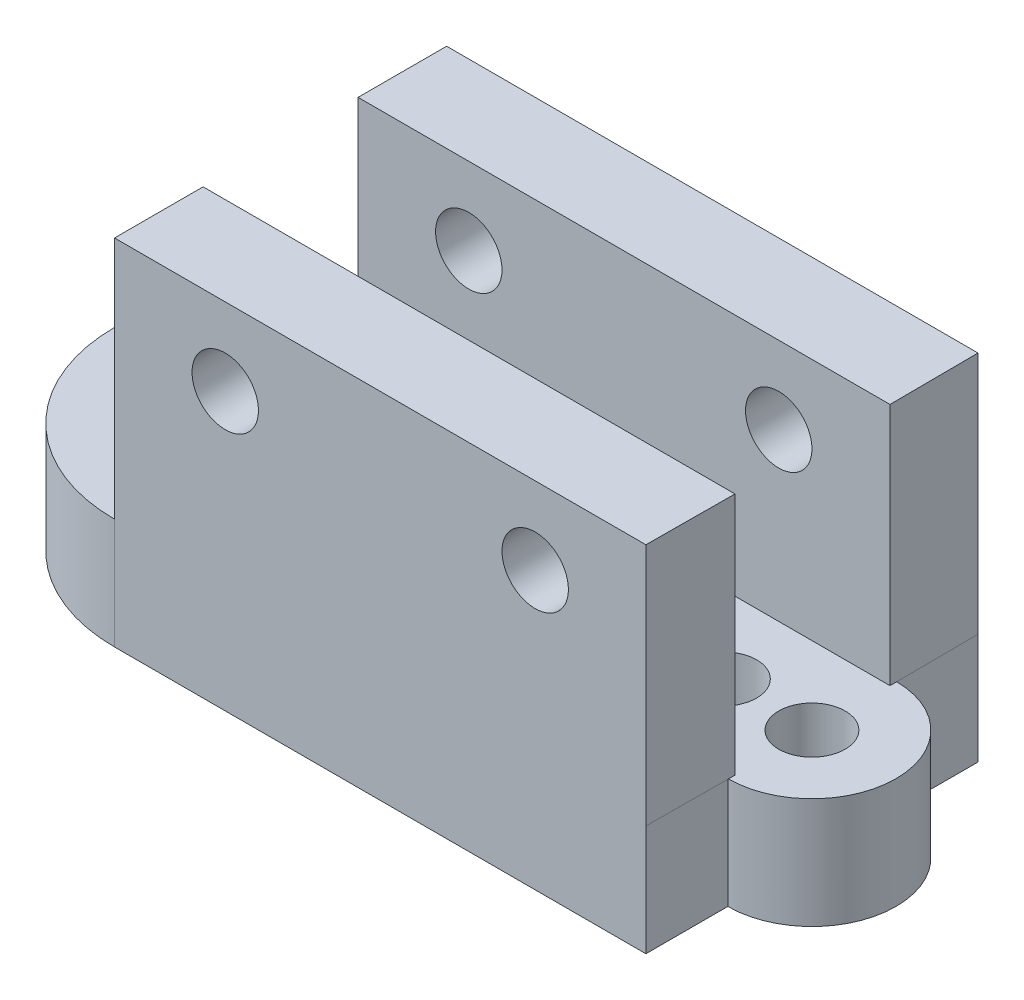
ISO-10303-21;
HEADER;
FILE_DESCRIPTION(('STEP AP214'),'2;1');
FILE_NAME('part.step','',(''),(''),'','','');
FILE_SCHEMA(('AUTOMOTIVE_DESIGN { 1 0 10303 214 1 1 1 1 }'));
ENDSEC;
DATA;
#1=APPLICATION_CONTEXT('core data for automotive mechanical design processes');
#2=APPLICATION_PROTOCOL_DEFINITION('international standard','automotive_design',2000,#1);
#3=PRODUCT_CONTEXT('',#1,'mechanical');
#4=PRODUCT('Part','Part','',(#3));
#5=PRODUCT_RELATED_PRODUCT_CATEGORY('part','',(#4));
#6=PRODUCT_DEFINITION_FORMATION('','',#4);
#7=PRODUCT_DEFINITION_CONTEXT('part definition',#1,'design');
#8=PRODUCT_DEFINITION('design','',#6,#7);
#9=PRODUCT_DEFINITION_SHAPE('','',#8);
#10=(LENGTH_UNIT() NAMED_UNIT(*) SI_UNIT(.MILLI.,.METRE.));
#11=(NAMED_UNIT(*) PLANE_ANGLE_UNIT() SI_UNIT($,.RADIAN.));
#12=(NAMED_UNIT(*) SI_UNIT($,.STERADIAN.) SOLID_ANGLE_UNIT());
#13=UNCERTAINTY_MEASURE_WITH_UNIT(LENGTH_MEASURE(1.E-05),#10,'distance_accuracy_value','');
#14=(GEOMETRIC_REPRESENTATION_CONTEXT(3) GLOBAL_UNCERTAINTY_ASSIGNED_CONTEXT((#13)) GLOBAL_UNIT_ASSIGNED_CONTEXT((#10,
#11,#12)) REPRESENTATION_CONTEXT('',''));
#15=CARTESIAN_POINT('',(0.,0.,0.));
#16=DIRECTION('',(0.,0.,1.));
#17=DIRECTION('',(1.,0.,0.));
#18=AXIS2_PLACEMENT_3D('',#15,#16,#17);
#19=CARTESIAN_POINT('',(0.,5.,7.5));
#20=DIRECTION('',(0.,0.,-1.));
#21=DIRECTION('',(-1.,0.,0.));
#22=AXIS2_PLACEMENT_3D('',#19,#20,#21);
#23=PLANE('',#22);
#24=CARTESIAN_POINT('',(5.00000000000008,12.5,7.5));
#25=DIRECTION('',(0.,0.,1.));
#26=DIRECTION('',(1.,0.,0.));
#27=AXIS2_PLACEMENT_3D('',#24,#25,#26);
#28=CIRCLE('',#27,1.5);
#29=CARTESIAN_POINT('',(6.50000000000008,12.5,7.5));
#30=VERTEX_POINT('',#29);
#31=EDGE_CURVE('E616',#30,#30,#28,.T.);
#32=ORIENTED_EDGE('',*,*,#31,.F.);
#33=EDGE_LOOP('',(#32));
#34=FACE_BOUND('',#33,.T.);
#35=DIRECTION('',(1.,0.,0.));
#36=VECTOR('',#35,1.);
#37=CARTESIAN_POINT('',(0.,0.,7.5));
#38=LINE('',#37,#36);
#39=CARTESIAN_POINT('',(0.,0.,7.5));
#40=VERTEX_POINT('',#39);
#41=CARTESIAN_POINT('',(24.,0.,7.5));
#42=VERTEX_POINT('',#41);
#43=EDGE_CURVE('E275',#40,#42,#38,.T.);
#44=ORIENTED_EDGE('',*,*,#43,.T.);
#45=DIRECTION('',(0.,-1.,0.));
#46=VECTOR('',#45,1.);
#47=CARTESIAN_POINT('',(24.,5.,7.5));
#48=LINE('',#47,#46);
#49=CARTESIAN_POINT('',(24.,5.,7.5));
#50=VERTEX_POINT('',#49);
#51=EDGE_CURVE('E290',#50,#42,#48,.T.);
#52=ORIENTED_EDGE('',*,*,#51,.F.);
#53=DIRECTION('',(0.,-1.,0.));
#54=VECTOR('',#53,1.);
#55=CARTESIAN_POINT('',(24.,16.,7.5));
#56=LINE('',#55,#54);
#57=CARTESIAN_POINT('',(24.,16.,7.5));
#58=VERTEX_POINT('',#57);
#59=EDGE_CURVE('E239',#58,#50,#56,.T.);
#60=ORIENTED_EDGE('',*,*,#59,.F.);
#61=DIRECTION('',(1.,0.,0.));
#62=VECTOR('',#61,1.);
#63=CARTESIAN_POINT('',(24.,16.,7.5));
#64=LINE('',#63,#62);
#65=CARTESIAN_POINT('',(0.,16.,7.5));
#66=VERTEX_POINT('',#65);
#67=EDGE_CURVE('E214',#66,#58,#64,.T.);
#68=ORIENTED_EDGE('',*,*,#67,.F.);
#69=DIRECTION('',(0.,-1.,0.));
#70=VECTOR('',#69,1.);
#71=CARTESIAN_POINT('',(0.,16.,7.5));
#72=LINE('',#71,#70);
#73=CARTESIAN_POINT('',(0.,5.,7.5));
#74=VERTEX_POINT('',#73);
#75=EDGE_CURVE('E223',#66,#74,#72,.T.);
#76=ORIENTED_EDGE('',*,*,#75,.T.);
#77=DIRECTION('',(0.,-1.,0.));
#78=VECTOR('',#77,1.);
#79=CARTESIAN_POINT('',(0.,5.,7.5));
#80=LINE('',#79,#78);
#81=EDGE_CURVE('E293',#74,#40,#80,.T.);
#82=ORIENTED_EDGE('',*,*,#81,.T.);
#83=EDGE_LOOP('',(#44,#52,#60,#68,#76,#82));
#84=FACE_BOUND('',#83,.T.);
#85=CARTESIAN_POINT('',(19.,12.5,7.5));
#86=DIRECTION('',(0.,0.,1.));
#87=DIRECTION('',(1.,0.,0.));
#88=AXIS2_PLACEMENT_3D('',#85,#86,#87);
#89=CIRCLE('',#88,1.5);
#90=CARTESIAN_POINT('',(20.5,12.5,7.5));
#91=VERTEX_POINT('',#90);
#92=EDGE_CURVE('E310',#91,#91,#89,.T.);
#93=ORIENTED_EDGE('',*,*,#92,.F.);
#94=EDGE_LOOP('',(#93));
#95=FACE_BOUND('',#94,.T.);
#96=ADVANCED_FACE('F36',(#34,#84,#95),#23,.F.);
#97=CARTESIAN_POINT('',(0.,5.,-7.5));
#98=DIRECTION('',(0.,0.,-1.));
#99=DIRECTION('',(-1.,0.,0.));
#100=AXIS2_PLACEMENT_3D('',#97,#98,#99);
#101=PLANE('',#100);
#102=CARTESIAN_POINT('',(5.00000000000008,12.5,-7.5));
#103=DIRECTION('',(0.,0.,1.));
#104=DIRECTION('',(1.,0.,0.));
#105=AXIS2_PLACEMENT_3D('',#102,#103,#104);
#106=CIRCLE('',#105,1.5);
#107=CARTESIAN_POINT('',(6.50000000000008,12.5,-7.5));
#108=VERTEX_POINT('',#107);
#109=EDGE_CURVE('E613',#108,#108,#106,.T.);
#110=ORIENTED_EDGE('',*,*,#109,.T.);
#111=EDGE_LOOP('',(#110));
#112=FACE_BOUND('',#111,.T.);
#113=DIRECTION('',(1.,0.,0.));
#114=VECTOR('',#113,1.);
#115=CARTESIAN_POINT('',(0.,0.,-7.5));
#116=LINE('',#115,#114);
#117=CARTESIAN_POINT('',(0.,0.,-7.5));
#118=VERTEX_POINT('',#117);
#119=CARTESIAN_POINT('',(24.,0.,-7.5));
#120=VERTEX_POINT('',#119);
#121=EDGE_CURVE('E270',#118,#120,#116,.T.);
#122=ORIENTED_EDGE('',*,*,#121,.F.);
#123=DIRECTION('',(0.,-1.,0.));
#124=VECTOR('',#123,1.);
#125=CARTESIAN_POINT('',(0.,5.,-7.5));
#126=LINE('',#125,#124);
#127=CARTESIAN_POINT('',(0.,5.,-7.5));
#128=VERTEX_POINT('',#127);
#129=EDGE_CURVE('E296',#128,#118,#126,.T.);
#130=ORIENTED_EDGE('',*,*,#129,.F.);
#131=DIRECTION('',(0.,-1.,0.));
#132=VECTOR('',#131,1.);
#133=CARTESIAN_POINT('',(0.,16.,-7.5));
#134=LINE('',#133,#132);
#135=CARTESIAN_POINT('',(0.,16.,-7.5));
#136=VERTEX_POINT('',#135);
#137=EDGE_CURVE('E206',#136,#128,#134,.T.);
#138=ORIENTED_EDGE('',*,*,#137,.F.);
#139=DIRECTION('',(-1.,0.,0.));
#140=VECTOR('',#139,1.);
#141=CARTESIAN_POINT('',(24.,16.,-7.5));
#142=LINE('',#141,#140);
#143=CARTESIAN_POINT('',(24.,16.,-7.5));
#144=VERTEX_POINT('',#143);
#145=EDGE_CURVE('E194',#144,#136,#142,.T.);
#146=ORIENTED_EDGE('',*,*,#145,.F.);
#147=DIRECTION('',(0.,-1.,0.));
#148=VECTOR('',#147,1.);
#149=CARTESIAN_POINT('',(24.,16.,-7.5));
#150=LINE('',#149,#148);
#151=CARTESIAN_POINT('',(24.,5.,-7.5));
#152=VERTEX_POINT('',#151);
#153=EDGE_CURVE('E208',#144,#152,#150,.T.);
#154=ORIENTED_EDGE('',*,*,#153,.T.);
#155=DIRECTION('',(0.,-1.,0.));
#156=VECTOR('',#155,1.);
#157=CARTESIAN_POINT('',(24.,5.,-7.5));
#158=LINE('',#157,#156);
#159=EDGE_CURVE('E298',#152,#120,#158,.T.);
#160=ORIENTED_EDGE('',*,*,#159,.T.);
#161=EDGE_LOOP('',(#122,#130,#138,#146,#154,#160));
#162=FACE_BOUND('',#161,.T.);
#163=CARTESIAN_POINT('',(19.,12.5,-7.5));
#164=DIRECTION('',(0.,0.,1.));
#165=DIRECTION('',(1.,0.,0.));
#166=AXIS2_PLACEMENT_3D('',#163,#164,#165);
#167=CIRCLE('',#166,1.5);
#168=CARTESIAN_POINT('',(20.5,12.5,-7.5));
#169=VERTEX_POINT('',#168);
#170=EDGE_CURVE('E303',#169,#169,#167,.T.);
#171=ORIENTED_EDGE('',*,*,#170,.T.);
#172=EDGE_LOOP('',(#171));
#173=FACE_BOUND('',#172,.T.);
#174=ADVANCED_FACE('F374',(#112,#162,#173),#101,.T.);
#175=CARTESIAN_POINT('',(0.,5.,0.));
#176=DIRECTION('',(0.,1.,0.));
#177=DIRECTION('',(0.,0.,1.));
#178=AXIS2_PLACEMENT_3D('',#175,#176,#177);
#179=PLANE('',#178);
#180=DIRECTION('',(0.,0.,1.));
#181=VECTOR('',#180,1.);
#182=CARTESIAN_POINT('',(12.,5.,0.));
#183=LINE('',#182,#181);
#184=CARTESIAN_POINT('',(12.,5.,-3.5));
#185=VERTEX_POINT('',#184);
#186=CARTESIAN_POINT('',(12.,5.,3.5));
#187=VERTEX_POINT('',#186);
#188=EDGE_CURVE('E307',#185,#187,#183,.T.);
#189=ORIENTED_EDGE('',*,*,#188,.T.);
#190=DIRECTION('',(-1.,0.,0.));
#191=VECTOR('',#190,1.);
#192=CARTESIAN_POINT('',(0.,5.,3.5));
#193=LINE('',#192,#191);
#194=CARTESIAN_POINT('',(24.0247124114035,5.,3.5));
#195=VERTEX_POINT('',#194);
#196=EDGE_CURVE('E226',#195,#187,#193,.T.);
#197=ORIENTED_EDGE('',*,*,#196,.F.);
#198=DIRECTION('',(0.0061779849483783,0.,-0.999980916068891));
#199=VECTOR('',#198,1.);
#200=CARTESIAN_POINT('',(24.0247124114035,5.,3.5));
#201=LINE('',#200,#199);
#202=CARTESIAN_POINT('',(24.0228594053392,5.,3.79993124248157));
#203=VERTEX_POINT('',#202);
#204=EDGE_CURVE('E11',#203,#195,#201,.T.);
#205=ORIENTED_EDGE('',*,*,#204,.F.);
#206=CARTESIAN_POINT('',(24.,5.,0.));
#207=DIRECTION('',(0.,1.,0.));
#208=DIRECTION('',(0.,0.,1.));
#209=AXIS2_PLACEMENT_3D('',#206,#207,#208);
#210=CIRCLE('',#209,3.8);
#211=CARTESIAN_POINT('',(24.0228594053392,5.,-3.79993124248157));
#212=VERTEX_POINT('',#211);
#213=EDGE_CURVE('E247',#212,#203,#210,.F.);
#214=ORIENTED_EDGE('',*,*,#213,.F.);
#215=DIRECTION('',(-0.0061779849483783,0.,-0.999980916068891));
#216=VECTOR('',#215,1.);
#217=CARTESIAN_POINT('',(24.0247124114035,5.,-3.5));
#218=LINE('',#217,#216);
#219=CARTESIAN_POINT('',(24.0247124114035,5.,-3.5));
#220=VERTEX_POINT('',#219);
#221=EDGE_CURVE('E201',#220,#212,#218,.T.);
#222=ORIENTED_EDGE('',*,*,#221,.F.);
#223=DIRECTION('',(1.,0.,0.));
#224=VECTOR('',#223,1.);
#225=CARTESIAN_POINT('',(0.,5.,-3.5));
#226=LINE('',#225,#224);
#227=EDGE_CURVE('E182',#185,#220,#226,.T.);
#228=ORIENTED_EDGE('',*,*,#227,.F.);
#229=EDGE_LOOP('',(#189,#197,#205,#214,#222,#228));
#230=FACE_BOUND('',#229,.T.);
#231=CARTESIAN_POINT('',(20.,5.,0.));
#232=DIRECTION('',(0.,1.,0.));
#233=DIRECTION('',(0.,0.,1.));
#234=AXIS2_PLACEMENT_3D('',#231,#232,#233);
#235=CIRCLE('',#234,1.5);
#236=CARTESIAN_POINT('',(20.,5.,1.5));
#237=VERTEX_POINT('',#236);
#238=EDGE_CURVE('E261',#237,#237,#235,.T.);
#239=ORIENTED_EDGE('',*,*,#238,.F.);
#240=EDGE_LOOP('',(#239));
#241=FACE_BOUND('',#240,.T.);
#242=CARTESIAN_POINT('',(24.,5.,0.));
#243=DIRECTION('',(0.,1.,0.));
#244=DIRECTION('',(0.,0.,1.));
#245=AXIS2_PLACEMENT_3D('',#242,#243,#244);
#246=CIRCLE('',#245,1.5);
#247=CARTESIAN_POINT('',(24.,5.,1.5));
#248=VERTEX_POINT('',#247);
#249=EDGE_CURVE('E258',#248,#248,#246,.T.);
#250=ORIENTED_EDGE('',*,*,#249,.F.);
#251=EDGE_LOOP('',(#250));
#252=FACE_BOUND('',#251,.T.);
#253=ADVANCED_FACE('F329',(#230,#241,#252),#179,.T.);
#254=DIRECTION('',(0.,0.,-1.));
#255=VECTOR('',#254,1.);
#256=CARTESIAN_POINT('',(8.,5.,0.));
#257=LINE('',#256,#255);
#258=CARTESIAN_POINT('',(8.,5.,3.5));
#259=VERTEX_POINT('',#258);
#260=CARTESIAN_POINT('',(8.,5.,-3.5));
#261=VERTEX_POINT('',#260);
#262=EDGE_CURVE('E319',#259,#261,#257,.T.);
#263=ORIENTED_EDGE('',*,*,#262,.T.);
#264=CARTESIAN_POINT('',(0.,5.,-3.5));
#265=VERTEX_POINT('',#264);
#266=EDGE_CURVE('E179',#265,#261,#226,.T.);
#267=ORIENTED_EDGE('',*,*,#266,.F.);
#268=DIRECTION('',(0.,0.,1.));
#269=VECTOR('',#268,1.);
#270=CARTESIAN_POINT('',(0.,5.,-7.5));
#271=LINE('',#270,#269);
#272=EDGE_CURVE('E192',#128,#265,#271,.T.);
#273=ORIENTED_EDGE('',*,*,#272,.F.);
#274=CARTESIAN_POINT('',(0.,5.,0.));
#275=DIRECTION('',(0.,1.,0.));
#276=DIRECTION('',(0.,0.,1.));
#277=AXIS2_PLACEMENT_3D('',#274,#275,#276);
#278=CIRCLE('',#277,7.5);
#279=EDGE_CURVE('E250',#128,#74,#278,.T.);
#280=ORIENTED_EDGE('',*,*,#279,.T.);
#281=DIRECTION('',(0.,0.,1.));
#282=VECTOR('',#281,1.);
#283=CARTESIAN_POINT('',(0.,5.,7.5));
#284=LINE('',#283,#282);
#285=CARTESIAN_POINT('',(0.,5.,3.5));
#286=VERTEX_POINT('',#285);
#287=EDGE_CURVE('E218',#286,#74,#284,.T.);
#288=ORIENTED_EDGE('',*,*,#287,.F.);
#289=EDGE_CURVE('E62',#259,#286,#193,.T.);
#290=ORIENTED_EDGE('',*,*,#289,.F.);
#291=EDGE_LOOP('',(#263,#267,#273,#280,#288,#290));
#292=FACE_BOUND('',#291,.T.);
#293=CARTESIAN_POINT('',(0.,5.,0.));
#294=DIRECTION('',(0.,1.,0.));
#295=DIRECTION('',(0.,0.,1.));
#296=AXIS2_PLACEMENT_3D('',#293,#294,#295);
#297=CIRCLE('',#296,1.5);
#298=CARTESIAN_POINT('',(0.,5.,1.5));
#299=VERTEX_POINT('',#298);
#300=EDGE_CURVE('E255',#299,#299,#297,.T.);
#301=ORIENTED_EDGE('',*,*,#300,.F.);
#302=EDGE_LOOP('',(#301));
#303=FACE_BOUND('',#302,.T.);
#304=ADVANCED_FACE('F368',(#292,#303),#179,.T.);
#305=CARTESIAN_POINT('',(24.,5.,0.));
#306=DIRECTION('',(0.,-1.,0.));
#307=DIRECTION('',(0.,0.,-1.));
#308=AXIS2_PLACEMENT_3D('',#305,#306,#307);
#309=CYLINDRICAL_SURFACE('',#308,3.8);
#310=CARTESIAN_POINT('',(24.,0.,0.));
#311=DIRECTION('',(0.,1.,0.));
#312=DIRECTION('',(0.,0.,1.));
#313=AXIS2_PLACEMENT_3D('',#310,#311,#312);
#314=CIRCLE('',#313,3.8);
#315=CARTESIAN_POINT('',(24.,0.,-3.8));
#316=VERTEX_POINT('',#315);
#317=CARTESIAN_POINT('',(24.,0.,3.8));
#318=VERTEX_POINT('',#317);
#319=EDGE_CURVE('E242',#316,#318,#314,.F.);
#320=ORIENTED_EDGE('',*,*,#319,.F.);
#321=DIRECTION('',(0.,-1.,0.));
#322=VECTOR('',#321,1.);
#323=CARTESIAN_POINT('',(24.,5.,-3.8));
#324=LINE('',#323,#322);
#325=CARTESIAN_POINT('',(24.,5.,-3.8));
#326=VERTEX_POINT('',#325);
#327=EDGE_CURVE('E45',#326,#316,#324,.T.);
#328=ORIENTED_EDGE('',*,*,#327,.F.);
#329=EDGE_CURVE('E243',#326,#212,#210,.F.);
#330=ORIENTED_EDGE('',*,*,#329,.T.);
#331=ORIENTED_EDGE('',*,*,#213,.T.);
#332=CARTESIAN_POINT('',(24.,5.,3.8));
#333=VERTEX_POINT('',#332);
#334=EDGE_CURVE('E248',#203,#333,#210,.F.);
#335=ORIENTED_EDGE('',*,*,#334,.T.);
#336=DIRECTION('',(0.,-1.,0.));
#337=VECTOR('',#336,1.);
#338=CARTESIAN_POINT('',(24.,5.,3.8));
#339=LINE('',#338,#337);
#340=EDGE_CURVE('E264',#333,#318,#339,.T.);
#341=ORIENTED_EDGE('',*,*,#340,.T.);
#342=EDGE_LOOP('',(#320,#328,#330,#331,#335,#341));
#343=FACE_BOUND('',#342,.T.);
#344=ADVANCED_FACE('F38',(#343),#309,.T.);
#345=CARTESIAN_POINT('',(24.,5.,0.));
#346=DIRECTION('',(-1.,0.,0.));
#347=DIRECTION('',(0.,0.,1.));
#348=AXIS2_PLACEMENT_3D('',#345,#346,#347);
#349=PLANE('',#348);
#350=DIRECTION('',(0.,0.,-1.));
#351=VECTOR('',#350,1.);
#352=CARTESIAN_POINT('',(24.,0.,0.));
#353=LINE('',#352,#351);
#354=EDGE_CURVE('E267',#316,#120,#353,.T.);
#355=ORIENTED_EDGE('',*,*,#354,.T.);
#356=ORIENTED_EDGE('',*,*,#159,.F.);
#357=DIRECTION('',(0.,0.,-1.));
#358=VECTOR('',#357,1.);
#359=CARTESIAN_POINT('',(24.,5.,0.));
#360=LINE('',#359,#358);
#361=EDGE_CURVE('E246',#326,#152,#360,.T.);
#362=ORIENTED_EDGE('',*,*,#361,.F.);
#363=ORIENTED_EDGE('',*,*,#327,.T.);
#364=EDGE_LOOP('',(#355,#356,#362,#363));
#365=FACE_BOUND('',#364,.T.);
#366=ADVANCED_FACE('F414',(#365),#349,.F.);
#367=CARTESIAN_POINT('',(0.,5.,0.));
#368=DIRECTION('',(0.,-1.,0.));
#369=DIRECTION('',(0.,0.,-1.));
#370=AXIS2_PLACEMENT_3D('',#367,#368,#369);
#371=CYLINDRICAL_SURFACE('',#370,7.5);
#372=CARTESIAN_POINT('',(0.,0.,0.));
#373=DIRECTION('',(0.,1.,0.));
#374=DIRECTION('',(0.,0.,1.));
#375=AXIS2_PLACEMENT_3D('',#372,#373,#374);
#376=CIRCLE('',#375,7.5);
#377=EDGE_CURVE('E273',#118,#40,#376,.T.);
#378=ORIENTED_EDGE('',*,*,#377,.T.);
#379=ORIENTED_EDGE('',*,*,#81,.F.);
#380=ORIENTED_EDGE('',*,*,#279,.F.);
#381=ORIENTED_EDGE('',*,*,#129,.T.);
#382=EDGE_LOOP('',(#378,#379,#380,#381));
#383=FACE_BOUND('',#382,.T.);
#384=ADVANCED_FACE('F377',(#383),#371,.T.);
#385=CARTESIAN_POINT('',(24.,5.,0.));
#386=DIRECTION('',(0.,-1.,0.));
#387=DIRECTION('',(0.,0.,-1.));
#388=AXIS2_PLACEMENT_3D('',#385,#386,#387);
#389=CYLINDRICAL_SURFACE('',#388,1.5);
#390=ORIENTED_EDGE('',*,*,#249,.T.);
#391=EDGE_LOOP('',(#390));
#392=FACE_BOUND('',#391,.T.);
#393=CARTESIAN_POINT('',(24.,0.,0.));
#394=DIRECTION('',(0.,1.,0.));
#395=DIRECTION('',(0.,0.,1.));
#396=AXIS2_PLACEMENT_3D('',#393,#394,#395);
#397=CIRCLE('',#396,1.5);
#398=CARTESIAN_POINT('',(24.,0.,1.5));
#399=VERTEX_POINT('',#398);
#400=EDGE_CURVE('E283',#399,#399,#397,.T.);
#401=ORIENTED_EDGE('',*,*,#400,.F.);
#402=EDGE_LOOP('',(#401));
#403=FACE_BOUND('',#402,.T.);
#404=ADVANCED_FACE('F413',(#392,#403),#389,.F.);
#405=CARTESIAN_POINT('',(0.,5.,0.));
#406=DIRECTION('',(0.,-1.,0.));
#407=DIRECTION('',(0.,0.,-1.));
#408=AXIS2_PLACEMENT_3D('',#405,#406,#407);
#409=CYLINDRICAL_SURFACE('',#408,1.5);
#410=ORIENTED_EDGE('',*,*,#300,.T.);
#411=EDGE_LOOP('',(#410));
#412=FACE_BOUND('',#411,.T.);
#413=CARTESIAN_POINT('',(0.,0.,0.));
#414=DIRECTION('',(0.,1.,0.));
#415=DIRECTION('',(0.,0.,1.));
#416=AXIS2_PLACEMENT_3D('',#413,#414,#415);
#417=CIRCLE('',#416,1.5);
#418=CARTESIAN_POINT('',(0.,0.,1.5));
#419=VERTEX_POINT('',#418);
#420=EDGE_CURVE('E280',#419,#419,#417,.T.);
#421=ORIENTED_EDGE('',*,*,#420,.F.);
#422=EDGE_LOOP('',(#421));
#423=FACE_BOUND('',#422,.T.);
#424=ADVANCED_FACE('F429',(#412,#423),#409,.F.);
#425=CARTESIAN_POINT('',(24.,5.,0.));
#426=DIRECTION('',(-1.,0.,0.));
#427=DIRECTION('',(0.,0.,1.));
#428=AXIS2_PLACEMENT_3D('',#425,#426,#427);
#429=PLANE('',#428);
#430=DIRECTION('',(0.,0.,-1.));
#431=VECTOR('',#430,1.);
#432=CARTESIAN_POINT('',(24.,0.,0.));
#433=LINE('',#432,#431);
#434=EDGE_CURVE('E277',#42,#318,#433,.T.);
#435=ORIENTED_EDGE('',*,*,#434,.T.);
#436=ORIENTED_EDGE('',*,*,#340,.F.);
#437=DIRECTION('',(0.,0.,-1.));
#438=VECTOR('',#437,1.);
#439=CARTESIAN_POINT('',(24.,5.,0.));
#440=LINE('',#439,#438);
#441=EDGE_CURVE('E252',#50,#333,#440,.T.);
#442=ORIENTED_EDGE('',*,*,#441,.F.);
#443=ORIENTED_EDGE('',*,*,#51,.T.);
#444=EDGE_LOOP('',(#435,#436,#442,#443));
#445=FACE_BOUND('',#444,.T.);
#446=ADVANCED_FACE('F410',(#445),#429,.F.);
#447=CARTESIAN_POINT('',(20.,5.,0.));
#448=DIRECTION('',(0.,-1.,0.));
#449=DIRECTION('',(0.,0.,-1.));
#450=AXIS2_PLACEMENT_3D('',#447,#448,#449);
#451=CYLINDRICAL_SURFACE('',#450,1.5);
#452=ORIENTED_EDGE('',*,*,#238,.T.);
#453=EDGE_LOOP('',(#452));
#454=FACE_BOUND('',#453,.T.);
#455=CARTESIAN_POINT('',(20.,0.,0.));
#456=DIRECTION('',(0.,1.,0.));
#457=DIRECTION('',(0.,0.,1.));
#458=AXIS2_PLACEMENT_3D('',#455,#456,#457);
#459=CIRCLE('',#458,1.5);
#460=CARTESIAN_POINT('',(20.,0.,1.5));
#461=VERTEX_POINT('',#460);
#462=EDGE_CURVE('E286',#461,#461,#459,.T.);
#463=ORIENTED_EDGE('',*,*,#462,.F.);
#464=EDGE_LOOP('',(#463));
#465=FACE_BOUND('',#464,.T.);
#466=ADVANCED_FACE('F428',(#454,#465),#451,.F.);
#467=CARTESIAN_POINT('',(0.,0.,0.));
#468=DIRECTION('',(0.,1.,0.));
#469=DIRECTION('',(0.,0.,1.));
#470=AXIS2_PLACEMENT_3D('',#467,#468,#469);
#471=PLANE('',#470);
#472=ORIENTED_EDGE('',*,*,#319,.T.);
#473=ORIENTED_EDGE('',*,*,#434,.F.);
#474=ORIENTED_EDGE('',*,*,#43,.F.);
#475=ORIENTED_EDGE('',*,*,#377,.F.);
#476=ORIENTED_EDGE('',*,*,#121,.T.);
#477=ORIENTED_EDGE('',*,*,#354,.F.);
#478=EDGE_LOOP('',(#472,#473,#474,#475,#476,#477));
#479=FACE_BOUND('',#478,.T.);
#480=ORIENTED_EDGE('',*,*,#420,.T.);
#481=EDGE_LOOP('',(#480));
#482=FACE_BOUND('',#481,.T.);
#483=ORIENTED_EDGE('',*,*,#400,.T.);
#484=EDGE_LOOP('',(#483));
#485=FACE_BOUND('',#484,.T.);
#486=ORIENTED_EDGE('',*,*,#462,.T.);
#487=EDGE_LOOP('',(#486));
#488=FACE_BOUND('',#487,.T.);
#489=ADVANCED_FACE('F423',(#479,#482,#485,#488),#471,.F.);
#490=CARTESIAN_POINT('',(0.,5.,0.));
#491=DIRECTION('',(0.,-1.,0.));
#492=DIRECTION('',(0.,0.,-1.));
#493=AXIS2_PLACEMENT_3D('',#490,#491,#492);
#494=PLANE('',#493);
#495=ORIENTED_EDGE('',*,*,#334,.F.);
#496=EDGE_CURVE('E47',#50,#203,#201,.T.);
#497=ORIENTED_EDGE('',*,*,#496,.F.);
#498=ORIENTED_EDGE('',*,*,#441,.T.);
#499=EDGE_LOOP('',(#495,#497,#498));
#500=FACE_BOUND('',#499,.T.);
#501=ADVANCED_FACE('F342',(#500),#494,.T.);
#502=CARTESIAN_POINT('',(24.0247124114035,16.,3.5));
#503=DIRECTION('',(-0.999980916068891,0.,-0.0061779849483783));
#504=DIRECTION('',(-0.0061779849483783,0.,0.999980916068891));
#505=AXIS2_PLACEMENT_3D('',#502,#503,#504);
#506=PLANE('',#505);
#507=ORIENTED_EDGE('',*,*,#496,.T.);
#508=ORIENTED_EDGE('',*,*,#204,.T.);
#509=DIRECTION('',(0.,-1.,0.));
#510=VECTOR('',#509,1.);
#511=CARTESIAN_POINT('',(24.0247124114035,16.,3.5));
#512=LINE('',#511,#510);
#513=CARTESIAN_POINT('',(24.0247124114035,16.,3.5));
#514=VERTEX_POINT('',#513);
#515=EDGE_CURVE('E236',#514,#195,#512,.T.);
#516=ORIENTED_EDGE('',*,*,#515,.F.);
#517=DIRECTION('',(0.0061779849483783,0.,-0.999980916068891));
#518=VECTOR('',#517,1.);
#519=CARTESIAN_POINT('',(24.0247124114035,16.,3.5));
#520=LINE('',#519,#518);
#521=EDGE_CURVE('E217',#58,#514,#520,.T.);
#522=ORIENTED_EDGE('',*,*,#521,.F.);
#523=ORIENTED_EDGE('',*,*,#59,.T.);
#524=EDGE_LOOP('',(#507,#508,#516,#522,#523));
#525=FACE_BOUND('',#524,.T.);
#526=ADVANCED_FACE('F337',(#525),#506,.F.);
#527=CARTESIAN_POINT('',(0.,16.,3.5));
#528=DIRECTION('',(0.,0.,1.));
#529=DIRECTION('',(1.,0.,0.));
#530=AXIS2_PLACEMENT_3D('',#527,#528,#529);
#531=PLANE('',#530);
#532=CARTESIAN_POINT('',(5.00000000000008,12.5,3.5));
#533=DIRECTION('',(0.,0.,1.));
#534=DIRECTION('',(1.,0.,0.));
#535=AXIS2_PLACEMENT_3D('',#532,#533,#534);
#536=CIRCLE('',#535,1.5);
#537=CARTESIAN_POINT('',(6.50000000000008,12.5,3.5));
#538=VERTEX_POINT('',#537);
#539=EDGE_CURVE('E315',#538,#538,#536,.T.);
#540=ORIENTED_EDGE('',*,*,#539,.T.);
#541=EDGE_LOOP('',(#540));
#542=FACE_BOUND('',#541,.T.);
#543=CARTESIAN_POINT('',(19.,12.5,3.5));
#544=DIRECTION('',(0.,0.,1.));
#545=DIRECTION('',(1.,0.,0.));
#546=AXIS2_PLACEMENT_3D('',#543,#544,#545);
#547=CIRCLE('',#546,1.5);
#548=CARTESIAN_POINT('',(20.5,12.5,3.5));
#549=VERTEX_POINT('',#548);
#550=EDGE_CURVE('E302',#549,#549,#547,.T.);
#551=ORIENTED_EDGE('',*,*,#550,.T.);
#552=EDGE_LOOP('',(#551));
#553=FACE_BOUND('',#552,.T.);
#554=ORIENTED_EDGE('',*,*,#196,.T.);
#555=DIRECTION('',(0.,-1.,0.));
#556=VECTOR('',#555,1.);
#557=CARTESIAN_POINT('',(12.,9.,3.5));
#558=LINE('',#557,#556);
#559=CARTESIAN_POINT('',(12.,9.,3.5));
#560=VERTEX_POINT('',#559);
#561=EDGE_CURVE('E184',#560,#187,#558,.T.);
#562=ORIENTED_EDGE('',*,*,#561,.F.);
#563=DIRECTION('',(1.,0.,0.));
#564=VECTOR('',#563,1.);
#565=CARTESIAN_POINT('',(0.,9.,3.5));
#566=LINE('',#565,#564);
#567=CARTESIAN_POINT('',(8.,9.,3.5));
#568=VERTEX_POINT('',#567);
#569=EDGE_CURVE('E173',#568,#560,#566,.T.);
#570=ORIENTED_EDGE('',*,*,#569,.F.);
#571=DIRECTION('',(0.,-1.,0.));
#572=VECTOR('',#571,1.);
#573=CARTESIAN_POINT('',(8.,9.,3.5));
#574=LINE('',#573,#572);
#575=EDGE_CURVE('E172',#568,#259,#574,.T.);
#576=ORIENTED_EDGE('',*,*,#575,.T.);
#577=ORIENTED_EDGE('',*,*,#289,.T.);
#578=DIRECTION('',(0.,-1.,0.));
#579=VECTOR('',#578,1.);
#580=CARTESIAN_POINT('',(0.,16.,3.5));
#581=LINE('',#580,#579);
#582=CARTESIAN_POINT('',(0.,16.,3.5));
#583=VERTEX_POINT('',#582);
#584=EDGE_CURVE('E233',#583,#286,#581,.T.);
#585=ORIENTED_EDGE('',*,*,#584,.F.);
#586=DIRECTION('',(-1.,0.,0.));
#587=VECTOR('',#586,1.);
#588=CARTESIAN_POINT('',(0.,16.,3.5));
#589=LINE('',#588,#587);
#590=EDGE_CURVE('E220',#514,#583,#589,.T.);
#591=ORIENTED_EDGE('',*,*,#590,.F.);
#592=ORIENTED_EDGE('',*,*,#515,.T.);
#593=EDGE_LOOP('',(#554,#562,#570,#576,#577,#585,#591,#592));
#594=FACE_BOUND('',#593,.T.);
#595=ADVANCED_FACE('F333',(#542,#553,#594),#531,.F.);
#596=CARTESIAN_POINT('',(0.,16.,7.5));
#597=DIRECTION('',(1.,0.,0.));
#598=DIRECTION('',(0.,0.,-1.));
#599=AXIS2_PLACEMENT_3D('',#596,#597,#598);
#600=PLANE('',#599);
#601=ORIENTED_EDGE('',*,*,#287,.T.);
#602=ORIENTED_EDGE('',*,*,#75,.F.);
#603=DIRECTION('',(0.,0.,1.));
#604=VECTOR('',#603,1.);
#605=CARTESIAN_POINT('',(0.,16.,7.5));
#606=LINE('',#605,#604);
#607=EDGE_CURVE('E222',#583,#66,#606,.T.);
#608=ORIENTED_EDGE('',*,*,#607,.F.);
#609=ORIENTED_EDGE('',*,*,#584,.T.);
#610=EDGE_LOOP('',(#601,#602,#608,#609));
#611=FACE_BOUND('',#610,.T.);
#612=ADVANCED_FACE('F382',(#611),#600,.F.);
#613=CARTESIAN_POINT('',(0.,16.,0.));
#614=DIRECTION('',(0.,-1.,0.));
#615=DIRECTION('',(0.,0.,-1.));
#616=AXIS2_PLACEMENT_3D('',#613,#614,#615);
#617=PLANE('',#616);
#618=ORIENTED_EDGE('',*,*,#67,.T.);
#619=ORIENTED_EDGE('',*,*,#521,.T.);
#620=ORIENTED_EDGE('',*,*,#590,.T.);
#621=ORIENTED_EDGE('',*,*,#607,.T.);
#622=EDGE_LOOP('',(#618,#619,#620,#621));
#623=FACE_BOUND('',#622,.T.);
#624=ADVANCED_FACE('F388',(#623),#617,.F.);
#625=CARTESIAN_POINT('',(0.,5.,0.));
#626=DIRECTION('',(0.,-1.,0.));
#627=DIRECTION('',(0.,0.,-1.));
#628=AXIS2_PLACEMENT_3D('',#625,#626,#627);
#629=PLANE('',#628);
#630=EDGE_CURVE('E200',#212,#152,#218,.T.);
#631=ORIENTED_EDGE('',*,*,#630,.F.);
#632=ORIENTED_EDGE('',*,*,#329,.F.);
#633=ORIENTED_EDGE('',*,*,#361,.T.);
#634=EDGE_LOOP('',(#631,#632,#633));
#635=FACE_BOUND('',#634,.T.);
#636=ADVANCED_FACE('F350',(#635),#629,.T.);
#637=CARTESIAN_POINT('',(0.,16.,-3.5));
#638=DIRECTION('',(0.,0.,-1.));
#639=DIRECTION('',(-1.,0.,0.));
#640=AXIS2_PLACEMENT_3D('',#637,#638,#639);
#641=PLANE('',#640);
#642=CARTESIAN_POINT('',(5.00000000000008,12.5,-3.5));
#643=DIRECTION('',(0.,0.,-1.));
#644=DIRECTION('',(-1.,0.,0.));
#645=AXIS2_PLACEMENT_3D('',#642,#643,#644);
#646=CIRCLE('',#645,1.5);
#647=CARTESIAN_POINT('',(3.50000000000008,12.5,-3.5));
#648=VERTEX_POINT('',#647);
#649=EDGE_CURVE('E40',#648,#648,#646,.T.);
#650=ORIENTED_EDGE('',*,*,#649,.T.);
#651=EDGE_LOOP('',(#650));
#652=FACE_BOUND('',#651,.T.);
#653=CARTESIAN_POINT('',(19.,12.5,-3.5));
#654=DIRECTION('',(0.,0.,-1.));
#655=DIRECTION('',(-1.,0.,0.));
#656=AXIS2_PLACEMENT_3D('',#653,#654,#655);
#657=CIRCLE('',#656,1.5);
#658=CARTESIAN_POINT('',(17.5,12.5,-3.5));
#659=VERTEX_POINT('',#658);
#660=EDGE_CURVE('E300',#659,#659,#657,.T.);
#661=ORIENTED_EDGE('',*,*,#660,.T.);
#662=EDGE_LOOP('',(#661));
#663=FACE_BOUND('',#662,.T.);
#664=DIRECTION('',(-1.,0.,0.));
#665=VECTOR('',#664,1.);
#666=CARTESIAN_POINT('',(0.,9.,-3.5));
#667=LINE('',#666,#665);
#668=CARTESIAN_POINT('',(12.,9.,-3.5));
#669=VERTEX_POINT('',#668);
#670=CARTESIAN_POINT('',(8.,9.,-3.5));
#671=VERTEX_POINT('',#670);
#672=EDGE_CURVE('E159',#669,#671,#667,.T.);
#673=ORIENTED_EDGE('',*,*,#672,.F.);
#674=DIRECTION('',(0.,-1.,0.));
#675=VECTOR('',#674,1.);
#676=CARTESIAN_POINT('',(12.,9.,-3.5));
#677=LINE('',#676,#675);
#678=EDGE_CURVE('E180',#669,#185,#677,.T.);
#679=ORIENTED_EDGE('',*,*,#678,.T.);
#680=ORIENTED_EDGE('',*,*,#227,.T.);
#681=DIRECTION('',(0.,-1.,0.));
#682=VECTOR('',#681,1.);
#683=CARTESIAN_POINT('',(24.0247124114035,16.,-3.5));
#684=LINE('',#683,#682);
#685=CARTESIAN_POINT('',(24.0247124114035,16.,-3.5));
#686=VERTEX_POINT('',#685);
#687=EDGE_CURVE('E211',#686,#220,#684,.T.);
#688=ORIENTED_EDGE('',*,*,#687,.F.);
#689=DIRECTION('',(1.,0.,0.));
#690=VECTOR('',#689,1.);
#691=CARTESIAN_POINT('',(0.,16.,-3.5));
#692=LINE('',#691,#690);
#693=CARTESIAN_POINT('',(0.,16.,-3.5));
#694=VERTEX_POINT('',#693);
#695=EDGE_CURVE('E188',#694,#686,#692,.T.);
#696=ORIENTED_EDGE('',*,*,#695,.F.);
#697=DIRECTION('',(0.,-1.,0.));
#698=VECTOR('',#697,1.);
#699=CARTESIAN_POINT('',(0.,16.,-3.5));
#700=LINE('',#699,#698);
#701=EDGE_CURVE('E198',#694,#265,#700,.T.);
#702=ORIENTED_EDGE('',*,*,#701,.T.);
#703=ORIENTED_EDGE('',*,*,#266,.T.);
#704=DIRECTION('',(0.,-1.,0.));
#705=VECTOR('',#704,1.);
#706=CARTESIAN_POINT('',(8.,9.,-3.5));
#707=LINE('',#706,#705);
#708=EDGE_CURVE('E170',#671,#261,#707,.T.);
#709=ORIENTED_EDGE('',*,*,#708,.F.);
#710=EDGE_LOOP('',(#673,#679,#680,#688,#696,#702,#703,#709));
#711=FACE_BOUND('',#710,.T.);
#712=ADVANCED_FACE('F176',(#652,#663,#711),#641,.F.);
#713=CARTESIAN_POINT('',(24.0247124114035,16.,-3.5));
#714=DIRECTION('',(-0.999980916068891,0.,0.0061779849483783));
#715=DIRECTION('',(0.0061779849483783,0.,0.999980916068891));
#716=AXIS2_PLACEMENT_3D('',#713,#714,#715);
#717=PLANE('',#716);
#718=ORIENTED_EDGE('',*,*,#221,.T.);
#719=ORIENTED_EDGE('',*,*,#630,.T.);
#720=ORIENTED_EDGE('',*,*,#153,.F.);
#721=DIRECTION('',(-0.0061779849483783,0.,-0.999980916068891));
#722=VECTOR('',#721,1.);
#723=CARTESIAN_POINT('',(24.0247124114035,16.,-3.5));
#724=LINE('',#723,#722);
#725=EDGE_CURVE('E191',#686,#144,#724,.T.);
#726=ORIENTED_EDGE('',*,*,#725,.F.);
#727=ORIENTED_EDGE('',*,*,#687,.T.);
#728=EDGE_LOOP('',(#718,#719,#720,#726,#727));
#729=FACE_BOUND('',#728,.T.);
#730=ADVANCED_FACE('F354',(#729),#717,.F.);
#731=CARTESIAN_POINT('',(0.,16.,-7.5));
#732=DIRECTION('',(1.,0.,0.));
#733=DIRECTION('',(0.,0.,-1.));
#734=AXIS2_PLACEMENT_3D('',#731,#732,#733);
#735=PLANE('',#734);
#736=ORIENTED_EDGE('',*,*,#272,.T.);
#737=ORIENTED_EDGE('',*,*,#701,.F.);
#738=DIRECTION('',(0.,0.,1.));
#739=VECTOR('',#738,1.);
#740=CARTESIAN_POINT('',(0.,16.,-7.5));
#741=LINE('',#740,#739);
#742=EDGE_CURVE('E196',#136,#694,#741,.T.);
#743=ORIENTED_EDGE('',*,*,#742,.F.);
#744=ORIENTED_EDGE('',*,*,#137,.T.);
#745=EDGE_LOOP('',(#736,#737,#743,#744));
#746=FACE_BOUND('',#745,.T.);
#747=ADVANCED_FACE('F364',(#746),#735,.F.);
#748=CARTESIAN_POINT('',(0.,16.,0.));
#749=DIRECTION('',(0.,-1.,0.));
#750=DIRECTION('',(0.,0.,-1.));
#751=AXIS2_PLACEMENT_3D('',#748,#749,#750);
#752=PLANE('',#751);
#753=ORIENTED_EDGE('',*,*,#695,.T.);
#754=ORIENTED_EDGE('',*,*,#725,.T.);
#755=ORIENTED_EDGE('',*,*,#145,.T.);
#756=ORIENTED_EDGE('',*,*,#742,.T.);
#757=EDGE_LOOP('',(#753,#754,#755,#756));
#758=FACE_BOUND('',#757,.T.);
#759=ADVANCED_FACE('F359',(#758),#752,.F.);
#760=CARTESIAN_POINT('',(12.,9.,0.));
#761=DIRECTION('',(1.,0.,0.));
#762=DIRECTION('',(0.,0.,-1.));
#763=AXIS2_PLACEMENT_3D('',#760,#761,#762);
#764=PLANE('',#763);
#765=ORIENTED_EDGE('',*,*,#188,.F.);
#766=ORIENTED_EDGE('',*,*,#678,.F.);
#767=DIRECTION('',(0.,0.,1.));
#768=VECTOR('',#767,1.);
#769=CARTESIAN_POINT('',(12.,9.,0.));
#770=LINE('',#769,#768);
#771=EDGE_CURVE('E54',#669,#560,#770,.T.);
#772=ORIENTED_EDGE('',*,*,#771,.T.);
#773=ORIENTED_EDGE('',*,*,#561,.T.);
#774=EDGE_LOOP('',(#765,#766,#772,#773));
#775=FACE_BOUND('',#774,.T.);
#776=ADVANCED_FACE('F326',(#775),#764,.T.);
#777=CARTESIAN_POINT('',(8.,9.,0.));
#778=DIRECTION('',(-1.,0.,0.));
#779=DIRECTION('',(0.,0.,1.));
#780=AXIS2_PLACEMENT_3D('',#777,#778,#779);
#781=PLANE('',#780);
#782=ORIENTED_EDGE('',*,*,#262,.F.);
#783=ORIENTED_EDGE('',*,*,#575,.F.);
#784=DIRECTION('',(0.,0.,-1.));
#785=VECTOR('',#784,1.);
#786=CARTESIAN_POINT('',(8.,9.,0.));
#787=LINE('',#786,#785);
#788=EDGE_CURVE('E162',#568,#671,#787,.T.);
#789=ORIENTED_EDGE('',*,*,#788,.T.);
#790=ORIENTED_EDGE('',*,*,#708,.T.);
#791=EDGE_LOOP('',(#782,#783,#789,#790));
#792=FACE_BOUND('',#791,.T.);
#793=ADVANCED_FACE('F169',(#792),#781,.T.);
#794=CARTESIAN_POINT('',(0.,9.,0.));
#795=DIRECTION('',(0.,1.,0.));
#796=DIRECTION('',(0.,0.,1.));
#797=AXIS2_PLACEMENT_3D('',#794,#795,#796);
#798=PLANE('',#797);
#799=ORIENTED_EDGE('',*,*,#771,.F.);
#800=ORIENTED_EDGE('',*,*,#672,.T.);
#801=ORIENTED_EDGE('',*,*,#788,.F.);
#802=ORIENTED_EDGE('',*,*,#569,.T.);
#803=EDGE_LOOP('',(#799,#800,#801,#802));
#804=FACE_BOUND('',#803,.T.);
#805=ADVANCED_FACE('F161',(#804),#798,.T.);
#806=CARTESIAN_POINT('',(19.,12.5,7.5));
#807=DIRECTION('',(0.,0.,1.));
#808=DIRECTION('',(1.,0.,0.));
#809=AXIS2_PLACEMENT_3D('',#806,#807,#808);
#810=CYLINDRICAL_SURFACE('',#809,1.5);
#811=ORIENTED_EDGE('',*,*,#170,.F.);
#812=EDGE_LOOP('',(#811));
#813=FACE_BOUND('',#812,.T.);
#814=ORIENTED_EDGE('',*,*,#660,.F.);
#815=EDGE_LOOP('',(#814));
#816=FACE_BOUND('',#815,.T.);
#817=ADVANCED_FACE('F548',(#813,#816),#810,.F.);
#818=ORIENTED_EDGE('',*,*,#92,.T.);
#819=EDGE_LOOP('',(#818));
#820=FACE_BOUND('',#819,.T.);
#821=ORIENTED_EDGE('',*,*,#550,.F.);
#822=EDGE_LOOP('',(#821));
#823=FACE_BOUND('',#822,.T.);
#824=ADVANCED_FACE('F575',(#820,#823),#810,.F.);
#825=CARTESIAN_POINT('',(5.00000000000008,12.5,7.5));
#826=DIRECTION('',(0.,0.,1.));
#827=DIRECTION('',(1.,0.,0.));
#828=AXIS2_PLACEMENT_3D('',#825,#826,#827);
#829=CYLINDRICAL_SURFACE('',#828,1.5);
#830=ORIENTED_EDGE('',*,*,#109,.F.);
#831=EDGE_LOOP('',(#830));
#832=FACE_BOUND('',#831,.T.);
#833=ORIENTED_EDGE('',*,*,#649,.F.);
#834=EDGE_LOOP('',(#833));
#835=FACE_BOUND('',#834,.T.);
#836=ADVANCED_FACE('F584',(#832,#835),#829,.F.);
#837=ORIENTED_EDGE('',*,*,#31,.T.);
#838=EDGE_LOOP('',(#837));
#839=FACE_BOUND('',#838,.T.);
#840=ORIENTED_EDGE('',*,*,#539,.F.);
#841=EDGE_LOOP('',(#840));
#842=FACE_BOUND('',#841,.T.);
#843=ADVANCED_FACE('F592',(#839,#842),#829,.F.);
#844=CLOSED_SHELL('',(#96,#174,#253,#304,#344,#366,#384,#404,#424,#446,#466,#489,#501,#526,#595,
#612,#624,#636,#712,#730,#747,#759,#776,#793,#805,#817,#824,#836,#843));
#845=MANIFOLD_SOLID_BREP('B2',#844);
#846=ADVANCED_BREP_SHAPE_REPRESENTATION('',(#18,#845),#14);
#847=SHAPE_DEFINITION_REPRESENTATION(#9,#846);
ENDSEC;
END-ISO-10303-21;
